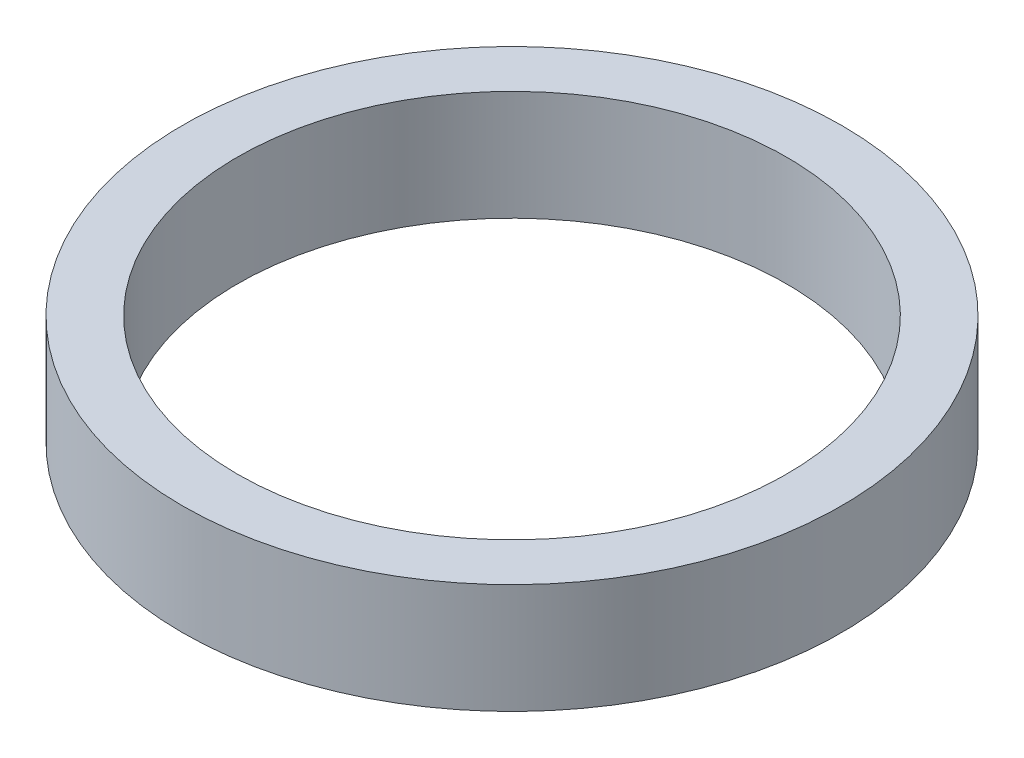
ISO-10303-21;
HEADER;
FILE_DESCRIPTION(('STEP AP214'),'2;1');
FILE_NAME('part.step','',(''),(''),'','','');
FILE_SCHEMA(('AUTOMOTIVE_DESIGN { 1 0 10303 214 1 1 1 1 }'));
ENDSEC;
DATA;
#1=APPLICATION_CONTEXT('core data for automotive mechanical design processes');
#2=APPLICATION_PROTOCOL_DEFINITION('international standard','automotive_design',2000,#1);
#3=PRODUCT_CONTEXT('',#1,'mechanical');
#4=PRODUCT('Part','Part','',(#3));
#5=PRODUCT_RELATED_PRODUCT_CATEGORY('part','',(#4));
#6=PRODUCT_DEFINITION_FORMATION('','',#4);
#7=PRODUCT_DEFINITION_CONTEXT('part definition',#1,'design');
#8=PRODUCT_DEFINITION('design','',#6,#7);
#9=PRODUCT_DEFINITION_SHAPE('','',#8);
#10=(LENGTH_UNIT() NAMED_UNIT(*) SI_UNIT(.MILLI.,.METRE.));
#11=(NAMED_UNIT(*) PLANE_ANGLE_UNIT() SI_UNIT($,.RADIAN.));
#12=(NAMED_UNIT(*) SI_UNIT($,.STERADIAN.) SOLID_ANGLE_UNIT());
#13=UNCERTAINTY_MEASURE_WITH_UNIT(LENGTH_MEASURE(1.E-05),#10,'distance_accuracy_value','');
#14=(GEOMETRIC_REPRESENTATION_CONTEXT(3) GLOBAL_UNCERTAINTY_ASSIGNED_CONTEXT((#13)) GLOBAL_UNIT_ASSIGNED_CONTEXT((#10,
#11,#12)) REPRESENTATION_CONTEXT('',''));
#15=CARTESIAN_POINT('',(0.,0.,0.));
#16=DIRECTION('',(0.,0.,1.));
#17=DIRECTION('',(1.,0.,0.));
#18=AXIS2_PLACEMENT_3D('',#15,#16,#17);
#19=CARTESIAN_POINT('',(0.,5.08,0.));
#20=DIRECTION('',(0.,-1.,0.));
#21=DIRECTION('',(0.,0.,-1.));
#22=AXIS2_PLACEMENT_3D('',#19,#20,#21);
#23=CYLINDRICAL_SURFACE('',#22,15.24);
#24=CARTESIAN_POINT('',(0.,5.08,0.));
#25=DIRECTION('',(0.,1.,0.));
#26=DIRECTION('',(0.,0.,1.));
#27=AXIS2_PLACEMENT_3D('',#24,#25,#26);
#28=CIRCLE('',#27,15.24);
#29=CARTESIAN_POINT('',(0.,5.08,15.24));
#30=VERTEX_POINT('',#29);
#31=EDGE_CURVE('E10',#30,#30,#28,.T.);
#32=ORIENTED_EDGE('',*,*,#31,.F.);
#33=EDGE_LOOP('',(#32));
#34=FACE_BOUND('',#33,.T.);
#35=CARTESIAN_POINT('',(0.,0.,0.));
#36=DIRECTION('',(0.,1.,0.));
#37=DIRECTION('',(0.,0.,1.));
#38=AXIS2_PLACEMENT_3D('',#35,#36,#37);
#39=CIRCLE('',#38,15.24);
#40=CARTESIAN_POINT('',(0.,0.,15.24));
#41=VERTEX_POINT('',#40);
#42=EDGE_CURVE('E33',#41,#41,#39,.T.);
#43=ORIENTED_EDGE('',*,*,#42,.T.);
#44=EDGE_LOOP('',(#43));
#45=FACE_BOUND('',#44,.T.);
#46=ADVANCED_FACE('F30',(#34,#45),#23,.T.);
#47=CARTESIAN_POINT('',(0.,5.08,0.));
#48=DIRECTION('',(0.,1.,0.));
#49=DIRECTION('',(0.,0.,1.));
#50=AXIS2_PLACEMENT_3D('',#47,#48,#49);
#51=PLANE('',#50);
#52=CARTESIAN_POINT('',(0.,5.08,0.));
#53=DIRECTION('',(0.,1.,0.));
#54=DIRECTION('',(0.,0.,1.));
#55=AXIS2_PLACEMENT_3D('',#52,#53,#54);
#56=CIRCLE('',#55,12.7);
#57=CARTESIAN_POINT('',(0.,5.08,12.7));
#58=VERTEX_POINT('',#57);
#59=EDGE_CURVE('E42',#58,#58,#56,.T.);
#60=ORIENTED_EDGE('',*,*,#59,.F.);
#61=EDGE_LOOP('',(#60));
#62=FACE_BOUND('',#61,.T.);
#63=ORIENTED_EDGE('',*,*,#31,.T.);
#64=EDGE_LOOP('',(#63));
#65=FACE_BOUND('',#64,.T.);
#66=ADVANCED_FACE('F57',(#62,#65),#51,.T.);
#67=CARTESIAN_POINT('',(0.,0.,0.));
#68=DIRECTION('',(0.,1.,0.));
#69=DIRECTION('',(0.,0.,1.));
#70=AXIS2_PLACEMENT_3D('',#67,#68,#69);
#71=PLANE('',#70);
#72=CARTESIAN_POINT('',(0.,0.,0.));
#73=DIRECTION('',(0.,1.,0.));
#74=DIRECTION('',(0.,0.,1.));
#75=AXIS2_PLACEMENT_3D('',#72,#73,#74);
#76=CIRCLE('',#75,12.7);
#77=CARTESIAN_POINT('',(0.,0.,12.7));
#78=VERTEX_POINT('',#77);
#79=EDGE_CURVE('E40',#78,#78,#76,.T.);
#80=ORIENTED_EDGE('',*,*,#79,.T.);
#81=EDGE_LOOP('',(#80));
#82=FACE_BOUND('',#81,.T.);
#83=ORIENTED_EDGE('',*,*,#42,.F.);
#84=EDGE_LOOP('',(#83));
#85=FACE_BOUND('',#84,.T.);
#86=ADVANCED_FACE('F48',(#82,#85),#71,.F.);
#87=CARTESIAN_POINT('',(0.,0.,0.));
#88=DIRECTION('',(0.,1.,0.));
#89=DIRECTION('',(0.,0.,1.));
#90=AXIS2_PLACEMENT_3D('',#87,#88,#89);
#91=CYLINDRICAL_SURFACE('',#90,12.7);
#92=ORIENTED_EDGE('',*,*,#79,.F.);
#93=EDGE_LOOP('',(#92));
#94=FACE_BOUND('',#93,.T.);
#95=ORIENTED_EDGE('',*,*,#59,.T.);
#96=EDGE_LOOP('',(#95));
#97=FACE_BOUND('',#96,.T.);
#98=ADVANCED_FACE('F51',(#94,#97),#91,.F.);
#99=CLOSED_SHELL('',(#46,#66,#86,#98));
#100=MANIFOLD_SOLID_BREP('B2',#99);
#101=ADVANCED_BREP_SHAPE_REPRESENTATION('',(#18,#100),#14);
#102=SHAPE_DEFINITION_REPRESENTATION(#9,#101);
ENDSEC;
END-ISO-10303-21;
